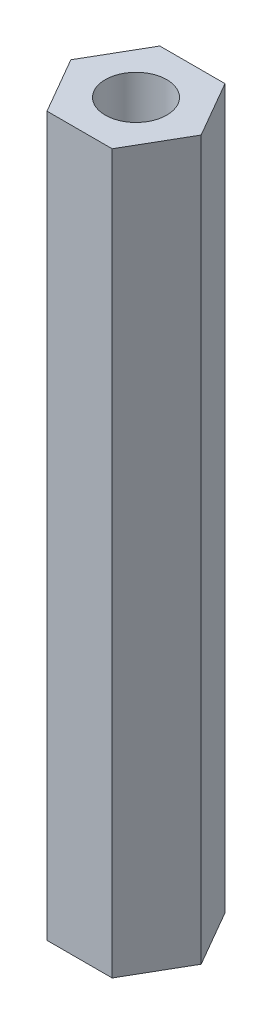
ISO-10303-21;
HEADER;
FILE_DESCRIPTION(('STEP AP214'),'2;1');
FILE_NAME('part.step','',(''),(''),'','','');
FILE_SCHEMA(('AUTOMOTIVE_DESIGN { 1 0 10303 214 1 1 1 1 }'));
ENDSEC;
DATA;
#1=APPLICATION_CONTEXT('core data for automotive mechanical design processes');
#2=APPLICATION_PROTOCOL_DEFINITION('international standard','automotive_design',2000,#1);
#3=PRODUCT_CONTEXT('',#1,'mechanical');
#4=PRODUCT('Part','Part','',(#3));
#5=PRODUCT_RELATED_PRODUCT_CATEGORY('part','',(#4));
#6=PRODUCT_DEFINITION_FORMATION('','',#4);
#7=PRODUCT_DEFINITION_CONTEXT('part definition',#1,'design');
#8=PRODUCT_DEFINITION('design','',#6,#7);
#9=PRODUCT_DEFINITION_SHAPE('','',#8);
#10=(LENGTH_UNIT() NAMED_UNIT(*) SI_UNIT(.MILLI.,.METRE.));
#11=(NAMED_UNIT(*) PLANE_ANGLE_UNIT() SI_UNIT($,.RADIAN.));
#12=(NAMED_UNIT(*) SI_UNIT($,.STERADIAN.) SOLID_ANGLE_UNIT());
#13=UNCERTAINTY_MEASURE_WITH_UNIT(LENGTH_MEASURE(1.E-05),#10,'distance_accuracy_value','');
#14=(GEOMETRIC_REPRESENTATION_CONTEXT(3) GLOBAL_UNCERTAINTY_ASSIGNED_CONTEXT((#13)) GLOBAL_UNIT_ASSIGNED_CONTEXT((#10,
#11,#12)) REPRESENTATION_CONTEXT('',''));
#15=CARTESIAN_POINT('',(0.,0.,0.));
#16=DIRECTION('',(0.,0.,1.));
#17=DIRECTION('',(1.,0.,0.));
#18=AXIS2_PLACEMENT_3D('',#15,#16,#17);
#19=CARTESIAN_POINT('',(1.5877132402715,35.,2.74999999999997));
#20=DIRECTION('',(-0.866025403784442,0.,-0.499999999999995));
#21=DIRECTION('',(-0.499999999999995,0.,0.866025403784442));
#22=AXIS2_PLACEMENT_3D('',#19,#20,#21);
#23=PLANE('',#22);
#24=DIRECTION('',(0.499999999999995,0.,-0.866025403784441));
#25=VECTOR('',#24,1.);
#26=CARTESIAN_POINT('',(1.5877132402715,0.,2.74999999999997));
#27=LINE('',#26,#25);
#28=CARTESIAN_POINT('',(1.5877132402715,0.,2.74999999999997));
#29=VERTEX_POINT('',#28);
#30=CARTESIAN_POINT('',(3.17542648054293,0.,0.));
#31=VERTEX_POINT('',#30);
#32=EDGE_CURVE('E116',#29,#31,#27,.T.);
#33=ORIENTED_EDGE('',*,*,#32,.T.);
#34=DIRECTION('',(0.,-1.,0.));
#35=VECTOR('',#34,1.);
#36=CARTESIAN_POINT('',(3.17542648054293,35.,0.));
#37=LINE('',#36,#35);
#38=CARTESIAN_POINT('',(3.17542648054293,35.,0.));
#39=VERTEX_POINT('',#38);
#40=EDGE_CURVE('E11',#39,#31,#37,.T.);
#41=ORIENTED_EDGE('',*,*,#40,.F.);
#42=DIRECTION('',(0.499999999999995,0.,-0.866025403784441));
#43=VECTOR('',#42,1.);
#44=CARTESIAN_POINT('',(1.5877132402715,35.,2.74999999999997));
#45=LINE('',#44,#43);
#46=CARTESIAN_POINT('',(1.5877132402715,35.,2.74999999999997));
#47=VERTEX_POINT('',#46);
#48=EDGE_CURVE('E127',#47,#39,#45,.T.);
#49=ORIENTED_EDGE('',*,*,#48,.F.);
#50=DIRECTION('',(0.,-1.,0.));
#51=VECTOR('',#50,1.);
#52=CARTESIAN_POINT('',(1.5877132402715,35.,2.74999999999997));
#53=LINE('',#52,#51);
#54=EDGE_CURVE('E112',#47,#29,#53,.T.);
#55=ORIENTED_EDGE('',*,*,#54,.T.);
#56=EDGE_LOOP('',(#33,#41,#49,#55));
#57=FACE_BOUND('',#56,.T.);
#58=ADVANCED_FACE('F32',(#57),#23,.F.);
#59=CARTESIAN_POINT('',(3.17542648054293,35.,0.));
#60=DIRECTION('',(-0.866025403784438,0.,0.500000000000001));
#61=DIRECTION('',(0.500000000000001,0.,0.866025403784438));
#62=AXIS2_PLACEMENT_3D('',#59,#60,#61);
#63=PLANE('',#62);
#64=DIRECTION('',(-0.500000000000001,0.,-0.866025403784438));
#65=VECTOR('',#64,1.);
#66=CARTESIAN_POINT('',(3.17542648054293,0.,0.));
#67=LINE('',#66,#65);
#68=CARTESIAN_POINT('',(1.58771324027146,0.,-2.74999999999999));
#69=VERTEX_POINT('',#68);
#70=EDGE_CURVE('E119',#31,#69,#67,.T.);
#71=ORIENTED_EDGE('',*,*,#70,.T.);
#72=DIRECTION('',(0.,-1.,0.));
#73=VECTOR('',#72,1.);
#74=CARTESIAN_POINT('',(1.58771324027146,35.,-2.74999999999999));
#75=LINE('',#74,#73);
#76=CARTESIAN_POINT('',(1.58771324027146,35.,-2.74999999999999));
#77=VERTEX_POINT('',#76);
#78=EDGE_CURVE('E40',#77,#69,#75,.T.);
#79=ORIENTED_EDGE('',*,*,#78,.F.);
#80=DIRECTION('',(-0.500000000000001,0.,-0.866025403784438));
#81=VECTOR('',#80,1.);
#82=CARTESIAN_POINT('',(3.17542648054293,35.,0.));
#83=LINE('',#82,#81);
#84=EDGE_CURVE('E85',#39,#77,#83,.T.);
#85=ORIENTED_EDGE('',*,*,#84,.F.);
#86=ORIENTED_EDGE('',*,*,#40,.T.);
#87=EDGE_LOOP('',(#71,#79,#85,#86));
#88=FACE_BOUND('',#87,.T.);
#89=ADVANCED_FACE('F152',(#88),#63,.F.);
#90=CARTESIAN_POINT('',(1.58771324027146,35.,-2.74999999999999));
#91=DIRECTION('',(0.,0.,1.));
#92=DIRECTION('',(1.,0.,0.));
#93=AXIS2_PLACEMENT_3D('',#90,#91,#92);
#94=PLANE('',#93);
#95=DIRECTION('',(-1.,0.,0.));
#96=VECTOR('',#95,1.);
#97=CARTESIAN_POINT('',(1.58771324027146,0.,-2.74999999999999));
#98=LINE('',#97,#96);
#99=CARTESIAN_POINT('',(-1.58771324027148,0.,-2.74999999999998));
#100=VERTEX_POINT('',#99);
#101=EDGE_CURVE('E122',#69,#100,#98,.T.);
#102=ORIENTED_EDGE('',*,*,#101,.T.);
#103=DIRECTION('',(0.,-1.,0.));
#104=VECTOR('',#103,1.);
#105=CARTESIAN_POINT('',(-1.58771324027148,35.,-2.74999999999998));
#106=LINE('',#105,#104);
#107=CARTESIAN_POINT('',(-1.58771324027148,35.,-2.74999999999998));
#108=VERTEX_POINT('',#107);
#109=EDGE_CURVE('E107',#108,#100,#106,.T.);
#110=ORIENTED_EDGE('',*,*,#109,.F.);
#111=DIRECTION('',(-1.,0.,0.));
#112=VECTOR('',#111,1.);
#113=CARTESIAN_POINT('',(1.58771324027146,35.,-2.74999999999999));
#114=LINE('',#113,#112);
#115=EDGE_CURVE('E98',#77,#108,#114,.T.);
#116=ORIENTED_EDGE('',*,*,#115,.F.);
#117=ORIENTED_EDGE('',*,*,#78,.T.);
#118=EDGE_LOOP('',(#102,#110,#116,#117));
#119=FACE_BOUND('',#118,.T.);
#120=ADVANCED_FACE('F133',(#119),#94,.F.);
#121=CARTESIAN_POINT('',(-1.58771324027148,35.,-2.74999999999998));
#122=DIRECTION('',(0.866025403784441,0.,0.499999999999995));
#123=DIRECTION('',(0.499999999999995,0.,-0.866025403784442));
#124=AXIS2_PLACEMENT_3D('',#121,#122,#123);
#125=PLANE('',#124);
#126=DIRECTION('',(-0.499999999999995,0.,0.866025403784442));
#127=VECTOR('',#126,1.);
#128=CARTESIAN_POINT('',(-1.58771324027148,0.,-2.74999999999998));
#129=LINE('',#128,#127);
#130=CARTESIAN_POINT('',(-3.17542648054293,0.,0.));
#131=VERTEX_POINT('',#130);
#132=EDGE_CURVE('E106',#100,#131,#129,.T.);
#133=ORIENTED_EDGE('',*,*,#132,.T.);
#134=DIRECTION('',(0.,-1.,0.));
#135=VECTOR('',#134,1.);
#136=CARTESIAN_POINT('',(-3.17542648054293,35.,0.));
#137=LINE('',#136,#135);
#138=CARTESIAN_POINT('',(-3.17542648054293,35.,0.));
#139=VERTEX_POINT('',#138);
#140=EDGE_CURVE('E103',#139,#131,#137,.T.);
#141=ORIENTED_EDGE('',*,*,#140,.F.);
#142=DIRECTION('',(-0.499999999999995,0.,0.866025403784442));
#143=VECTOR('',#142,1.);
#144=CARTESIAN_POINT('',(-1.58771324027148,35.,-2.74999999999998));
#145=LINE('',#144,#143);
#146=EDGE_CURVE('E92',#108,#139,#145,.T.);
#147=ORIENTED_EDGE('',*,*,#146,.F.);
#148=ORIENTED_EDGE('',*,*,#109,.T.);
#149=EDGE_LOOP('',(#133,#141,#147,#148));
#150=FACE_BOUND('',#149,.T.);
#151=ADVANCED_FACE('F104',(#150),#125,.F.);
#152=CARTESIAN_POINT('',(-3.17542648054293,35.,0.));
#153=DIRECTION('',(0.866025403784435,0.,-0.500000000000007));
#154=DIRECTION('',(-0.500000000000007,0.,-0.866025403784435));
#155=AXIS2_PLACEMENT_3D('',#152,#153,#154);
#156=PLANE('',#155);
#157=DIRECTION('',(0.500000000000007,0.,0.866025403784435));
#158=VECTOR('',#157,1.);
#159=CARTESIAN_POINT('',(-3.17542648054293,0.,0.));
#160=LINE('',#159,#158);
#161=CARTESIAN_POINT('',(-1.58771324027144,0.,2.75));
#162=VERTEX_POINT('',#161);
#163=EDGE_CURVE('E71',#131,#162,#160,.T.);
#164=ORIENTED_EDGE('',*,*,#163,.T.);
#165=DIRECTION('',(0.,-1.,0.));
#166=VECTOR('',#165,1.);
#167=CARTESIAN_POINT('',(-1.58771324027144,35.,2.75));
#168=LINE('',#167,#166);
#169=CARTESIAN_POINT('',(-1.58771324027144,35.,2.75));
#170=VERTEX_POINT('',#169);
#171=EDGE_CURVE('E108',#170,#162,#168,.T.);
#172=ORIENTED_EDGE('',*,*,#171,.F.);
#173=DIRECTION('',(0.500000000000007,0.,0.866025403784435));
#174=VECTOR('',#173,1.);
#175=CARTESIAN_POINT('',(-3.17542648054293,35.,0.));
#176=LINE('',#175,#174);
#177=EDGE_CURVE('E96',#139,#170,#176,.T.);
#178=ORIENTED_EDGE('',*,*,#177,.F.);
#179=ORIENTED_EDGE('',*,*,#140,.T.);
#180=EDGE_LOOP('',(#164,#172,#178,#179));
#181=FACE_BOUND('',#180,.T.);
#182=ADVANCED_FACE('F110',(#181),#156,.F.);
#183=CARTESIAN_POINT('',(-1.58771324027144,35.,2.75));
#184=DIRECTION('',(0.,0.,-1.));
#185=DIRECTION('',(-1.,0.,0.));
#186=AXIS2_PLACEMENT_3D('',#183,#184,#185);
#187=PLANE('',#186);
#188=DIRECTION('',(1.,0.,0.));
#189=VECTOR('',#188,1.);
#190=CARTESIAN_POINT('',(-1.58771324027144,0.,2.75));
#191=LINE('',#190,#189);
#192=EDGE_CURVE('E77',#162,#29,#191,.T.);
#193=ORIENTED_EDGE('',*,*,#192,.T.);
#194=ORIENTED_EDGE('',*,*,#54,.F.);
#195=DIRECTION('',(1.,0.,0.));
#196=VECTOR('',#195,1.);
#197=CARTESIAN_POINT('',(-1.58771324027144,35.,2.75));
#198=LINE('',#197,#196);
#199=EDGE_CURVE('E48',#170,#47,#198,.T.);
#200=ORIENTED_EDGE('',*,*,#199,.F.);
#201=ORIENTED_EDGE('',*,*,#171,.T.);
#202=EDGE_LOOP('',(#193,#194,#200,#201));
#203=FACE_BOUND('',#202,.T.);
#204=ADVANCED_FACE('F140',(#203),#187,.F.);
#205=CARTESIAN_POINT('',(0.,35.,0.));
#206=DIRECTION('',(0.,1.,0.));
#207=DIRECTION('',(0.,0.,1.));
#208=AXIS2_PLACEMENT_3D('',#205,#206,#207);
#209=PLANE('',#208);
#210=CARTESIAN_POINT('',(0.,35.,0.));
#211=DIRECTION('',(0.,1.,0.));
#212=DIRECTION('',(0.,0.,1.));
#213=AXIS2_PLACEMENT_3D('',#210,#211,#212);
#214=CIRCLE('',#213,1.5);
#215=CARTESIAN_POINT('',(0.,35.,1.5));
#216=VERTEX_POINT('',#215);
#217=EDGE_CURVE('E235',#216,#216,#214,.T.);
#218=ORIENTED_EDGE('',*,*,#217,.F.);
#219=EDGE_LOOP('',(#218));
#220=FACE_BOUND('',#219,.T.);
#221=ORIENTED_EDGE('',*,*,#48,.T.);
#222=ORIENTED_EDGE('',*,*,#84,.T.);
#223=ORIENTED_EDGE('',*,*,#115,.T.);
#224=ORIENTED_EDGE('',*,*,#146,.T.);
#225=ORIENTED_EDGE('',*,*,#177,.T.);
#226=ORIENTED_EDGE('',*,*,#199,.T.);
#227=EDGE_LOOP('',(#221,#222,#223,#224,#225,#226));
#228=FACE_BOUND('',#227,.T.);
#229=ADVANCED_FACE('F94',(#220,#228),#209,.T.);
#230=CARTESIAN_POINT('',(0.,0.,0.));
#231=DIRECTION('',(0.,1.,0.));
#232=DIRECTION('',(0.,0.,1.));
#233=AXIS2_PLACEMENT_3D('',#230,#231,#232);
#234=PLANE('',#233);
#235=CARTESIAN_POINT('',(0.,0.,0.));
#236=DIRECTION('',(0.,1.,0.));
#237=DIRECTION('',(0.,0.,1.));
#238=AXIS2_PLACEMENT_3D('',#235,#236,#237);
#239=CIRCLE('',#238,1.5);
#240=CARTESIAN_POINT('',(0.,0.,1.5));
#241=VERTEX_POINT('',#240);
#242=EDGE_CURVE('E236',#241,#241,#239,.T.);
#243=ORIENTED_EDGE('',*,*,#242,.T.);
#244=EDGE_LOOP('',(#243));
#245=FACE_BOUND('',#244,.T.);
#246=ORIENTED_EDGE('',*,*,#32,.F.);
#247=ORIENTED_EDGE('',*,*,#192,.F.);
#248=ORIENTED_EDGE('',*,*,#163,.F.);
#249=ORIENTED_EDGE('',*,*,#132,.F.);
#250=ORIENTED_EDGE('',*,*,#101,.F.);
#251=ORIENTED_EDGE('',*,*,#70,.F.);
#252=EDGE_LOOP('',(#246,#247,#248,#249,#250,#251));
#253=FACE_BOUND('',#252,.T.);
#254=ADVANCED_FACE('F136',(#245,#253),#234,.F.);
#255=CARTESIAN_POINT('',(0.,25.,0.));
#256=DIRECTION('',(0.,1.,0.));
#257=DIRECTION('',(0.,0.,1.));
#258=AXIS2_PLACEMENT_3D('',#255,#256,#257);
#259=CYLINDRICAL_SURFACE('',#258,1.5);
#260=CARTESIAN_POINT('',(0.,25.,0.));
#261=DIRECTION('',(0.,1.,0.));
#262=DIRECTION('',(0.,0.,1.));
#263=AXIS2_PLACEMENT_3D('',#260,#261,#262);
#264=CIRCLE('',#263,1.5);
#265=CARTESIAN_POINT('',(0.,25.,1.5));
#266=VERTEX_POINT('',#265);
#267=EDGE_CURVE('E120',#266,#266,#264,.T.);
#268=ORIENTED_EDGE('',*,*,#267,.F.);
#269=EDGE_LOOP('',(#268));
#270=FACE_BOUND('',#269,.T.);
#271=ORIENTED_EDGE('',*,*,#217,.T.);
#272=EDGE_LOOP('',(#271));
#273=FACE_BOUND('',#272,.T.);
#274=ADVANCED_FACE('F187',(#270,#273),#259,.F.);
#275=CARTESIAN_POINT('',(0.,25.,0.));
#276=DIRECTION('',(0.,1.,0.));
#277=DIRECTION('',(0.,0.,1.));
#278=AXIS2_PLACEMENT_3D('',#275,#276,#277);
#279=PLANE('',#278);
#280=ORIENTED_EDGE('',*,*,#267,.T.);
#281=EDGE_LOOP('',(#280));
#282=FACE_BOUND('',#281,.T.);
#283=ADVANCED_FACE('F192',(#282),#279,.T.);
#284=CARTESIAN_POINT('',(0.,10.,0.));
#285=DIRECTION('',(0.,-1.,0.));
#286=DIRECTION('',(0.,0.,-1.));
#287=AXIS2_PLACEMENT_3D('',#284,#285,#286);
#288=CYLINDRICAL_SURFACE('',#287,1.5);
#289=CARTESIAN_POINT('',(0.,10.,0.));
#290=DIRECTION('',(0.,1.,0.));
#291=DIRECTION('',(0.,0.,1.));
#292=AXIS2_PLACEMENT_3D('',#289,#290,#291);
#293=CIRCLE('',#292,1.5);
#294=CARTESIAN_POINT('',(0.,10.,1.5));
#295=VERTEX_POINT('',#294);
#296=EDGE_CURVE('E234',#295,#295,#293,.T.);
#297=ORIENTED_EDGE('',*,*,#296,.T.);
#298=EDGE_LOOP('',(#297));
#299=FACE_BOUND('',#298,.T.);
#300=ORIENTED_EDGE('',*,*,#242,.F.);
#301=EDGE_LOOP('',(#300));
#302=FACE_BOUND('',#301,.T.);
#303=ADVANCED_FACE('F202',(#299,#302),#288,.F.);
#304=CARTESIAN_POINT('',(0.,10.,0.));
#305=DIRECTION('',(0.,-1.,0.));
#306=DIRECTION('',(0.,0.,1.));
#307=AXIS2_PLACEMENT_3D('',#304,#305,#306);
#308=PLANE('',#307);
#309=ORIENTED_EDGE('',*,*,#296,.F.);
#310=EDGE_LOOP('',(#309));
#311=FACE_BOUND('',#310,.T.);
#312=ADVANCED_FACE('F218',(#311),#308,.T.);
#313=CLOSED_SHELL('',(#58,#89,#120,#151,#182,#204,#229,#254,#274,#283,#303,#312));
#314=MANIFOLD_SOLID_BREP('B2',#313);
#315=ADVANCED_BREP_SHAPE_REPRESENTATION('',(#18,#314),#14);
#316=SHAPE_DEFINITION_REPRESENTATION(#9,#315);
ENDSEC;
END-ISO-10303-21;
